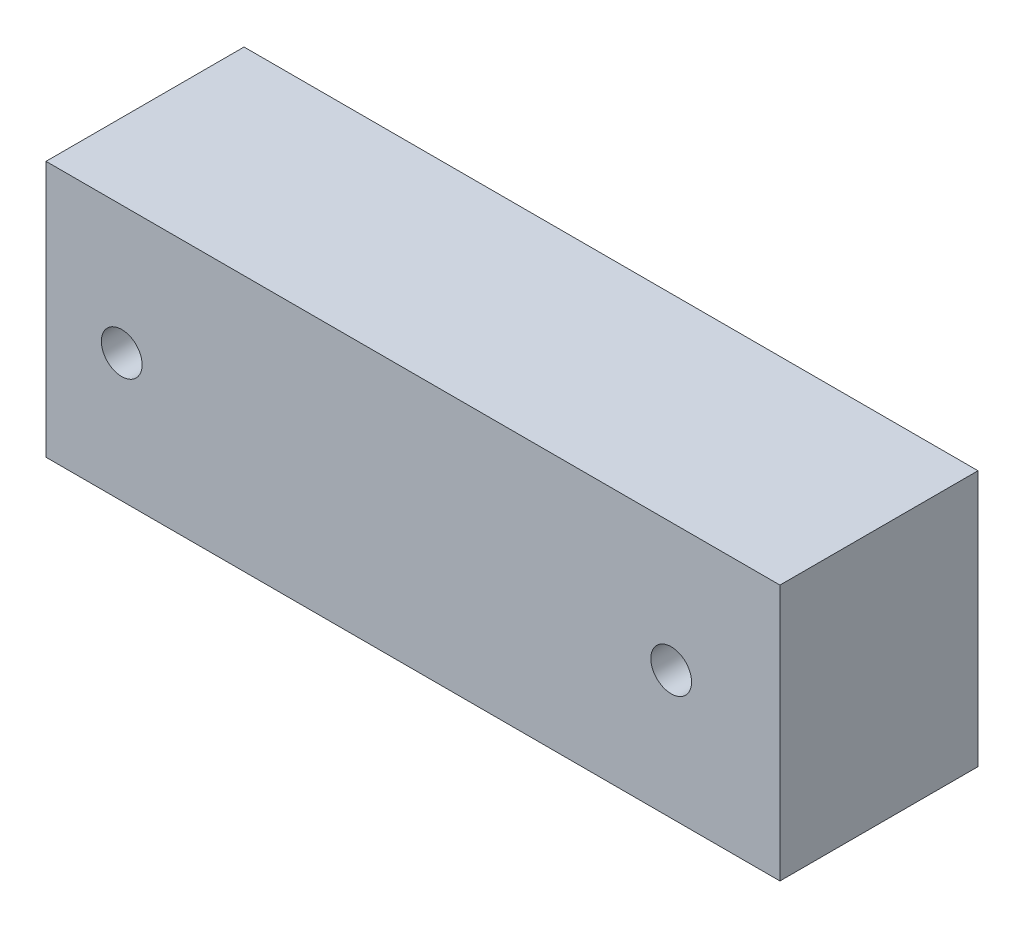
ISO-10303-21;
HEADER;
FILE_DESCRIPTION(('STEP AP214'),'2;1');
FILE_NAME('part.step','',(''),(''),'','','');
FILE_SCHEMA(('AUTOMOTIVE_DESIGN { 1 0 10303 214 1 1 1 1 }'));
ENDSEC;
DATA;
#1=APPLICATION_CONTEXT('core data for automotive mechanical design processes');
#2=APPLICATION_PROTOCOL_DEFINITION('international standard','automotive_design',2000,#1);
#3=PRODUCT_CONTEXT('',#1,'mechanical');
#4=PRODUCT('Part','Part','',(#3));
#5=PRODUCT_RELATED_PRODUCT_CATEGORY('part','',(#4));
#6=PRODUCT_DEFINITION_FORMATION('','',#4);
#7=PRODUCT_DEFINITION_CONTEXT('part definition',#1,'design');
#8=PRODUCT_DEFINITION('design','',#6,#7);
#9=PRODUCT_DEFINITION_SHAPE('','',#8);
#10=(LENGTH_UNIT() NAMED_UNIT(*) SI_UNIT(.MILLI.,.METRE.));
#11=(NAMED_UNIT(*) PLANE_ANGLE_UNIT() SI_UNIT($,.RADIAN.));
#12=(NAMED_UNIT(*) SI_UNIT($,.STERADIAN.) SOLID_ANGLE_UNIT());
#13=UNCERTAINTY_MEASURE_WITH_UNIT(LENGTH_MEASURE(1.E-05),#10,'distance_accuracy_value','');
#14=(GEOMETRIC_REPRESENTATION_CONTEXT(3) GLOBAL_UNCERTAINTY_ASSIGNED_CONTEXT((#13)) GLOBAL_UNIT_ASSIGNED_CONTEXT((#10,
#11,#12)) REPRESENTATION_CONTEXT('',''));
#15=CARTESIAN_POINT('',(0.,0.,0.));
#16=DIRECTION('',(0.,0.,1.));
#17=DIRECTION('',(1.,0.,0.));
#18=AXIS2_PLACEMENT_3D('',#15,#16,#17);
#19=CARTESIAN_POINT('',(31.5,11.,17.));
#20=DIRECTION('',(-1.,0.,0.));
#21=DIRECTION('',(0.,-1.,0.));
#22=AXIS2_PLACEMENT_3D('',#19,#20,#21);
#23=PLANE('',#22);
#24=DIRECTION('',(0.,1.,0.));
#25=VECTOR('',#24,1.);
#26=CARTESIAN_POINT('',(31.5,11.,0.));
#27=LINE('',#26,#25);
#28=CARTESIAN_POINT('',(31.5,-11.,0.));
#29=VERTEX_POINT('',#28);
#30=CARTESIAN_POINT('',(31.5,11.,0.));
#31=VERTEX_POINT('',#30);
#32=EDGE_CURVE('E107',#29,#31,#27,.T.);
#33=ORIENTED_EDGE('',*,*,#32,.T.);
#34=DIRECTION('',(0.,0.,-1.));
#35=VECTOR('',#34,1.);
#36=CARTESIAN_POINT('',(31.5,11.,17.));
#37=LINE('',#36,#35);
#38=CARTESIAN_POINT('',(31.5,11.,17.));
#39=VERTEX_POINT('',#38);
#40=EDGE_CURVE('E11',#39,#31,#37,.T.);
#41=ORIENTED_EDGE('',*,*,#40,.F.);
#42=DIRECTION('',(0.,1.,0.));
#43=VECTOR('',#42,1.);
#44=CARTESIAN_POINT('',(31.5,11.,17.));
#45=LINE('',#44,#43);
#46=CARTESIAN_POINT('',(31.5,-11.,17.));
#47=VERTEX_POINT('',#46);
#48=EDGE_CURVE('E91',#47,#39,#45,.T.);
#49=ORIENTED_EDGE('',*,*,#48,.F.);
#50=DIRECTION('',(0.,0.,-1.));
#51=VECTOR('',#50,1.);
#52=CARTESIAN_POINT('',(31.5,-11.,17.));
#53=LINE('',#52,#51);
#54=EDGE_CURVE('E103',#47,#29,#53,.T.);
#55=ORIENTED_EDGE('',*,*,#54,.T.);
#56=EDGE_LOOP('',(#33,#41,#49,#55));
#57=FACE_BOUND('',#56,.T.);
#58=ADVANCED_FACE('F39',(#57),#23,.F.);
#59=CARTESIAN_POINT('',(-31.5,11.,17.));
#60=DIRECTION('',(0.,-1.,0.));
#61=DIRECTION('',(0.,0.,-1.));
#62=AXIS2_PLACEMENT_3D('',#59,#60,#61);
#63=PLANE('',#62);
#64=DIRECTION('',(-1.,0.,0.));
#65=VECTOR('',#64,1.);
#66=CARTESIAN_POINT('',(-31.5,11.,0.));
#67=LINE('',#66,#65);
#68=CARTESIAN_POINT('',(-31.5,11.,0.));
#69=VERTEX_POINT('',#68);
#70=EDGE_CURVE('E96',#31,#69,#67,.T.);
#71=ORIENTED_EDGE('',*,*,#70,.T.);
#72=DIRECTION('',(0.,0.,-1.));
#73=VECTOR('',#72,1.);
#74=CARTESIAN_POINT('',(-31.5,11.,17.));
#75=LINE('',#74,#73);
#76=CARTESIAN_POINT('',(-31.5,11.,17.));
#77=VERTEX_POINT('',#76);
#78=EDGE_CURVE('E48',#77,#69,#75,.T.);
#79=ORIENTED_EDGE('',*,*,#78,.F.);
#80=DIRECTION('',(-1.,0.,0.));
#81=VECTOR('',#80,1.);
#82=CARTESIAN_POINT('',(-31.5,11.,17.));
#83=LINE('',#82,#81);
#84=EDGE_CURVE('E86',#39,#77,#83,.T.);
#85=ORIENTED_EDGE('',*,*,#84,.F.);
#86=ORIENTED_EDGE('',*,*,#40,.T.);
#87=EDGE_LOOP('',(#71,#79,#85,#86));
#88=FACE_BOUND('',#87,.T.);
#89=ADVANCED_FACE('F95',(#88),#63,.F.);
#90=CARTESIAN_POINT('',(-31.5,11.,17.));
#91=DIRECTION('',(1.,0.,0.));
#92=DIRECTION('',(0.,0.,-1.));
#93=AXIS2_PLACEMENT_3D('',#90,#91,#92);
#94=PLANE('',#93);
#95=DIRECTION('',(0.,-1.,0.));
#96=VECTOR('',#95,1.);
#97=CARTESIAN_POINT('',(-31.5,11.,0.));
#98=LINE('',#97,#96);
#99=CARTESIAN_POINT('',(-31.5,-11.,0.));
#100=VERTEX_POINT('',#99);
#101=EDGE_CURVE('E73',#69,#100,#98,.T.);
#102=ORIENTED_EDGE('',*,*,#101,.T.);
#103=DIRECTION('',(0.,0.,-1.));
#104=VECTOR('',#103,1.);
#105=CARTESIAN_POINT('',(-31.5,-11.,17.));
#106=LINE('',#105,#104);
#107=CARTESIAN_POINT('',(-31.5,-11.,17.));
#108=VERTEX_POINT('',#107);
#109=EDGE_CURVE('E98',#108,#100,#106,.T.);
#110=ORIENTED_EDGE('',*,*,#109,.F.);
#111=DIRECTION('',(0.,-1.,0.));
#112=VECTOR('',#111,1.);
#113=CARTESIAN_POINT('',(-31.5,11.,17.));
#114=LINE('',#113,#112);
#115=EDGE_CURVE('E89',#77,#108,#114,.T.);
#116=ORIENTED_EDGE('',*,*,#115,.F.);
#117=ORIENTED_EDGE('',*,*,#78,.T.);
#118=EDGE_LOOP('',(#102,#110,#116,#117));
#119=FACE_BOUND('',#118,.T.);
#120=ADVANCED_FACE('F99',(#119),#94,.F.);
#121=CARTESIAN_POINT('',(-31.5,-11.,17.));
#122=DIRECTION('',(0.,1.,0.));
#123=DIRECTION('',(0.,0.,1.));
#124=AXIS2_PLACEMENT_3D('',#121,#122,#123);
#125=PLANE('',#124);
#126=DIRECTION('',(1.,0.,0.));
#127=VECTOR('',#126,1.);
#128=CARTESIAN_POINT('',(-31.5,-11.,0.));
#129=LINE('',#128,#127);
#130=EDGE_CURVE('E79',#100,#29,#129,.T.);
#131=ORIENTED_EDGE('',*,*,#130,.T.);
#132=ORIENTED_EDGE('',*,*,#54,.F.);
#133=DIRECTION('',(1.,0.,0.));
#134=VECTOR('',#133,1.);
#135=CARTESIAN_POINT('',(-31.5,-11.,17.));
#136=LINE('',#135,#134);
#137=EDGE_CURVE('E56',#108,#47,#136,.T.);
#138=ORIENTED_EDGE('',*,*,#137,.F.);
#139=ORIENTED_EDGE('',*,*,#109,.T.);
#140=EDGE_LOOP('',(#131,#132,#138,#139));
#141=FACE_BOUND('',#140,.T.);
#142=ADVANCED_FACE('F121',(#141),#125,.F.);
#143=CARTESIAN_POINT('',(0.,0.,17.));
#144=DIRECTION('',(0.,0.,1.));
#145=DIRECTION('',(1.,0.,0.));
#146=AXIS2_PLACEMENT_3D('',#143,#144,#145);
#147=PLANE('',#146);
#148=CARTESIAN_POINT('',(-25.,0.,17.));
#149=DIRECTION('',(0.,0.,1.));
#150=DIRECTION('',(1.,0.,0.));
#151=AXIS2_PLACEMENT_3D('',#148,#149,#150);
#152=CIRCLE('',#151,1.75);
#153=CARTESIAN_POINT('',(-23.25,0.,17.));
#154=VERTEX_POINT('',#153);
#155=EDGE_CURVE('E136',#154,#154,#152,.T.);
#156=ORIENTED_EDGE('',*,*,#155,.F.);
#157=EDGE_LOOP('',(#156));
#158=FACE_BOUND('',#157,.T.);
#159=CARTESIAN_POINT('',(22.1655645662897,0.,17.));
#160=DIRECTION('',(0.,0.,1.));
#161=DIRECTION('',(1.,0.,0.));
#162=AXIS2_PLACEMENT_3D('',#159,#160,#161);
#163=CIRCLE('',#162,1.75);
#164=CARTESIAN_POINT('',(23.9155645662897,0.,17.));
#165=VERTEX_POINT('',#164);
#166=EDGE_CURVE('E128',#165,#165,#163,.T.);
#167=ORIENTED_EDGE('',*,*,#166,.F.);
#168=EDGE_LOOP('',(#167));
#169=FACE_BOUND('',#168,.T.);
#170=ORIENTED_EDGE('',*,*,#48,.T.);
#171=ORIENTED_EDGE('',*,*,#84,.T.);
#172=ORIENTED_EDGE('',*,*,#115,.T.);
#173=ORIENTED_EDGE('',*,*,#137,.T.);
#174=EDGE_LOOP('',(#170,#171,#172,#173));
#175=FACE_BOUND('',#174,.T.);
#176=ADVANCED_FACE('F87',(#158,#169,#175),#147,.T.);
#177=CARTESIAN_POINT('',(0.,0.,0.));
#178=DIRECTION('',(0.,0.,1.));
#179=DIRECTION('',(1.,0.,0.));
#180=AXIS2_PLACEMENT_3D('',#177,#178,#179);
#181=PLANE('',#180);
#182=CARTESIAN_POINT('',(-25.,0.,0.));
#183=DIRECTION('',(0.,0.,1.));
#184=DIRECTION('',(1.,0.,0.));
#185=AXIS2_PLACEMENT_3D('',#182,#183,#184);
#186=CIRCLE('',#185,1.75);
#187=CARTESIAN_POINT('',(-23.25,0.,0.));
#188=VERTEX_POINT('',#187);
#189=EDGE_CURVE('E111',#188,#188,#186,.T.);
#190=ORIENTED_EDGE('',*,*,#189,.T.);
#191=EDGE_LOOP('',(#190));
#192=FACE_BOUND('',#191,.T.);
#193=CARTESIAN_POINT('',(22.1655645662897,0.,0.));
#194=DIRECTION('',(0.,0.,1.));
#195=DIRECTION('',(1.,0.,0.));
#196=AXIS2_PLACEMENT_3D('',#193,#194,#195);
#197=CIRCLE('',#196,1.75);
#198=CARTESIAN_POINT('',(23.9155645662897,0.,0.));
#199=VERTEX_POINT('',#198);
#200=EDGE_CURVE('E132',#199,#199,#197,.T.);
#201=ORIENTED_EDGE('',*,*,#200,.T.);
#202=EDGE_LOOP('',(#201));
#203=FACE_BOUND('',#202,.T.);
#204=ORIENTED_EDGE('',*,*,#32,.F.);
#205=ORIENTED_EDGE('',*,*,#130,.F.);
#206=ORIENTED_EDGE('',*,*,#101,.F.);
#207=ORIENTED_EDGE('',*,*,#70,.F.);
#208=EDGE_LOOP('',(#204,#205,#206,#207));
#209=FACE_BOUND('',#208,.T.);
#210=ADVANCED_FACE('F124',(#192,#203,#209),#181,.F.);
#211=CARTESIAN_POINT('',(22.1655645662897,0.,0.));
#212=DIRECTION('',(0.,0.,1.));
#213=DIRECTION('',(1.,0.,0.));
#214=AXIS2_PLACEMENT_3D('',#211,#212,#213);
#215=CYLINDRICAL_SURFACE('',#214,1.75);
#216=ORIENTED_EDGE('',*,*,#200,.F.);
#217=EDGE_LOOP('',(#216));
#218=FACE_BOUND('',#217,.T.);
#219=ORIENTED_EDGE('',*,*,#166,.T.);
#220=EDGE_LOOP('',(#219));
#221=FACE_BOUND('',#220,.T.);
#222=ADVANCED_FACE('F149',(#218,#221),#215,.F.);
#223=CARTESIAN_POINT('',(-25.,0.,0.));
#224=DIRECTION('',(0.,0.,1.));
#225=DIRECTION('',(1.,0.,0.));
#226=AXIS2_PLACEMENT_3D('',#223,#224,#225);
#227=CYLINDRICAL_SURFACE('',#226,1.75);
#228=ORIENTED_EDGE('',*,*,#189,.F.);
#229=EDGE_LOOP('',(#228));
#230=FACE_BOUND('',#229,.T.);
#231=ORIENTED_EDGE('',*,*,#155,.T.);
#232=EDGE_LOOP('',(#231));
#233=FACE_BOUND('',#232,.T.);
#234=ADVANCED_FACE('F146',(#230,#233),#227,.F.);
#235=CLOSED_SHELL('',(#58,#89,#120,#142,#176,#210,#222,#234));
#236=MANIFOLD_SOLID_BREP('B2',#235);
#237=ADVANCED_BREP_SHAPE_REPRESENTATION('',(#18,#236),#14);
#238=SHAPE_DEFINITION_REPRESENTATION(#9,#237);
ENDSEC;
END-ISO-10303-21;
